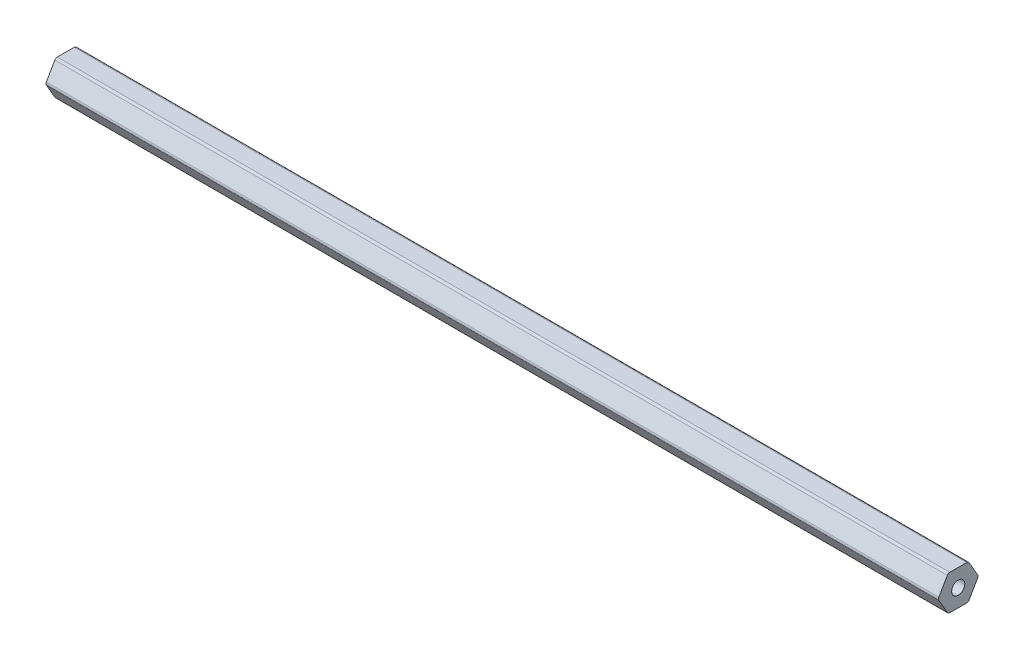
ISO-10303-21;
HEADER;
FILE_DESCRIPTION(('STEP AP214'),'2;1');
FILE_NAME('part.step','',(''),(''),'','','');
FILE_SCHEMA(('AUTOMOTIVE_DESIGN { 1 0 10303 214 1 1 1 1 }'));
ENDSEC;
DATA;
#1=APPLICATION_CONTEXT('core data for automotive mechanical design processes');
#2=APPLICATION_PROTOCOL_DEFINITION('international standard','automotive_design',2000,#1);
#3=PRODUCT_CONTEXT('',#1,'mechanical');
#4=PRODUCT('Part','Part','',(#3));
#5=PRODUCT_RELATED_PRODUCT_CATEGORY('part','',(#4));
#6=PRODUCT_DEFINITION_FORMATION('','',#4);
#7=PRODUCT_DEFINITION_CONTEXT('part definition',#1,'design');
#8=PRODUCT_DEFINITION('design','',#6,#7);
#9=PRODUCT_DEFINITION_SHAPE('','',#8);
#10=(LENGTH_UNIT() NAMED_UNIT(*) SI_UNIT(.MILLI.,.METRE.));
#11=(NAMED_UNIT(*) PLANE_ANGLE_UNIT() SI_UNIT($,.RADIAN.));
#12=(NAMED_UNIT(*) SI_UNIT($,.STERADIAN.) SOLID_ANGLE_UNIT());
#13=UNCERTAINTY_MEASURE_WITH_UNIT(LENGTH_MEASURE(1.E-05),#10,'distance_accuracy_value','');
#14=(GEOMETRIC_REPRESENTATION_CONTEXT(3) GLOBAL_UNCERTAINTY_ASSIGNED_CONTEXT((#13)) GLOBAL_UNIT_ASSIGNED_CONTEXT((#10,
#11,#12)) REPRESENTATION_CONTEXT('',''));
#15=CARTESIAN_POINT('',(0.,0.,0.));
#16=DIRECTION('',(0.,0.,1.));
#17=DIRECTION('',(1.,0.,0.));
#18=AXIS2_PLACEMENT_3D('',#15,#16,#17);
#19=CARTESIAN_POINT('',(323.85,5.334,-3.07958633585748));
#20=DIRECTION('',(-1.,0.,0.));
#21=DIRECTION('',(0.,0.,1.));
#22=AXIS2_PLACEMENT_3D('',#19,#20,#21);
#23=PLANE('',#22);
#24=CARTESIAN_POINT('',(323.85,5.334,-3.07958633585748));
#25=DIRECTION('',(1.,0.,0.));
#26=DIRECTION('',(0.,0.,1.));
#27=AXIS2_PLACEMENT_3D('',#24,#25,#26);
#28=CIRCLE('',#27,1.016);
#29=CARTESIAN_POINT('',(323.85,5.84199999999999,-3.95946814610247));
#30=VERTEX_POINT('',#29);
#31=CARTESIAN_POINT('',(323.85,6.34999999999999,-3.07958633585748));
#32=VERTEX_POINT('',#31);
#33=EDGE_CURVE('E206',#30,#32,#28,.T.);
#34=ORIENTED_EDGE('',*,*,#33,.T.);
#35=DIRECTION('',(0.,0.,1.));
#36=VECTOR('',#35,1.);
#37=CARTESIAN_POINT('',(323.85,6.34999999999999,-3.07958633585748));
#38=LINE('',#37,#36);
#39=CARTESIAN_POINT('',(323.85,6.35000000000001,3.07958633585745));
#40=VERTEX_POINT('',#39);
#41=EDGE_CURVE('E118',#32,#40,#38,.T.);
#42=ORIENTED_EDGE('',*,*,#41,.T.);
#43=CARTESIAN_POINT('',(323.85,5.33400000000001,3.07958633585745));
#44=DIRECTION('',(1.,0.,0.));
#45=DIRECTION('',(0.,0.,1.));
#46=AXIS2_PLACEMENT_3D('',#43,#44,#45);
#47=CIRCLE('',#46,1.016);
#48=CARTESIAN_POINT('',(323.85,5.84200000000001,3.95946814610244));
#49=VERTEX_POINT('',#48);
#50=EDGE_CURVE('E243',#40,#49,#47,.T.);
#51=ORIENTED_EDGE('',*,*,#50,.T.);
#52=DIRECTION('',(0.,-0.866025403784437,0.500000000000003));
#53=VECTOR('',#52,1.);
#54=CARTESIAN_POINT('',(323.85,5.84200000000001,3.95946814610244));
#55=LINE('',#54,#53);
#56=CARTESIAN_POINT('',(323.85,0.508000000000022,7.03905448195992));
#57=VERTEX_POINT('',#56);
#58=EDGE_CURVE('E263',#49,#57,#55,.T.);
#59=ORIENTED_EDGE('',*,*,#58,.T.);
#60=CARTESIAN_POINT('',(323.85,0.,6.15917267171493));
#61=DIRECTION('',(1.,0.,0.));
#62=DIRECTION('',(0.,0.,1.));
#63=AXIS2_PLACEMENT_3D('',#60,#61,#62);
#64=CIRCLE('',#63,1.016);
#65=CARTESIAN_POINT('',(323.85,-0.50799999999998,7.03905448195993));
#66=VERTEX_POINT('',#65);
#67=EDGE_CURVE('E259',#57,#66,#64,.T.);
#68=ORIENTED_EDGE('',*,*,#67,.T.);
#69=DIRECTION('',(0.,-0.86602540378444,-0.499999999999998));
#70=VECTOR('',#69,1.);
#71=CARTESIAN_POINT('',(323.85,-0.507999999999979,7.03905448195992));
#72=LINE('',#71,#70);
#73=CARTESIAN_POINT('',(323.85,-5.84199999999999,3.95946814610247));
#74=VERTEX_POINT('',#73);
#75=EDGE_CURVE('E262',#66,#74,#72,.T.);
#76=ORIENTED_EDGE('',*,*,#75,.T.);
#77=CARTESIAN_POINT('',(323.85,-5.334,3.07958633585748));
#78=DIRECTION('',(1.,0.,0.));
#79=DIRECTION('',(0.,0.,1.));
#80=AXIS2_PLACEMENT_3D('',#77,#78,#79);
#81=CIRCLE('',#80,1.016);
#82=CARTESIAN_POINT('',(323.85,-6.35,3.07958633585748));
#83=VERTEX_POINT('',#82);
#84=EDGE_CURVE('E267',#74,#83,#81,.T.);
#85=ORIENTED_EDGE('',*,*,#84,.T.);
#86=DIRECTION('',(0.,0.,-1.));
#87=VECTOR('',#86,1.);
#88=CARTESIAN_POINT('',(323.85,-6.35,3.07958633585748));
#89=LINE('',#88,#87);
#90=CARTESIAN_POINT('',(323.85,-6.35000000000001,-3.07958633585745));
#91=VERTEX_POINT('',#90);
#92=EDGE_CURVE('E274',#83,#91,#89,.T.);
#93=ORIENTED_EDGE('',*,*,#92,.T.);
#94=CARTESIAN_POINT('',(323.85,-5.33400000000001,-3.07958633585745));
#95=DIRECTION('',(1.,0.,0.));
#96=DIRECTION('',(0.,0.,1.));
#97=AXIS2_PLACEMENT_3D('',#94,#95,#96);
#98=CIRCLE('',#97,1.016);
#99=CARTESIAN_POINT('',(323.85,-5.84200000000001,-3.95946814610244));
#100=VERTEX_POINT('',#99);
#101=EDGE_CURVE('E149',#91,#100,#98,.T.);
#102=ORIENTED_EDGE('',*,*,#101,.T.);
#103=DIRECTION('',(0.,0.866025403784437,-0.500000000000002));
#104=VECTOR('',#103,1.);
#105=CARTESIAN_POINT('',(323.85,-5.84200000000001,-3.95946814610244));
#106=LINE('',#105,#104);
#107=CARTESIAN_POINT('',(323.85,-0.508000000000019,-7.03905448195992));
#108=VERTEX_POINT('',#107);
#109=EDGE_CURVE('E143',#100,#108,#106,.T.);
#110=ORIENTED_EDGE('',*,*,#109,.T.);
#111=CARTESIAN_POINT('',(323.85,0.,-6.15917267171493));
#112=DIRECTION('',(1.,0.,0.));
#113=DIRECTION('',(0.,0.,1.));
#114=AXIS2_PLACEMENT_3D('',#111,#112,#113);
#115=CIRCLE('',#114,1.016);
#116=CARTESIAN_POINT('',(323.85,0.507999999999981,-7.03905448195992));
#117=VERTEX_POINT('',#116);
#118=EDGE_CURVE('E147',#108,#117,#115,.T.);
#119=ORIENTED_EDGE('',*,*,#118,.T.);
#120=DIRECTION('',(0.,0.86602540378444,0.499999999999997));
#121=VECTOR('',#120,1.);
#122=CARTESIAN_POINT('',(323.85,0.50799999999998,-7.03905448195992));
#123=LINE('',#122,#121);
#124=EDGE_CURVE('E63',#117,#30,#123,.T.);
#125=ORIENTED_EDGE('',*,*,#124,.T.);
#126=EDGE_LOOP('',(#34,#42,#51,#59,#68,#76,#85,#93,#102,#110,#119,#125));
#127=FACE_BOUND('',#126,.T.);
#128=CARTESIAN_POINT('',(323.85,0.,0.));
#129=DIRECTION('',(1.,0.,0.));
#130=DIRECTION('',(0.,0.,-1.));
#131=AXIS2_PLACEMENT_3D('',#128,#129,#130);
#132=CIRCLE('',#131,2.38125);
#133=CARTESIAN_POINT('',(323.85,0.,-2.38125));
#134=VERTEX_POINT('',#133);
#135=EDGE_CURVE('E176',#134,#134,#132,.T.);
#136=ORIENTED_EDGE('',*,*,#135,.F.);
#137=EDGE_LOOP('',(#136));
#138=FACE_BOUND('',#137,.T.);
#139=ADVANCED_FACE('F45',(#127,#138),#23,.F.);
#140=CARTESIAN_POINT('',(0.,5.334,-3.07958633585748));
#141=DIRECTION('',(-1.,0.,0.));
#142=DIRECTION('',(0.,0.,1.));
#143=AXIS2_PLACEMENT_3D('',#140,#141,#142);
#144=PLANE('',#143);
#145=CARTESIAN_POINT('',(0.,5.334,-3.07958633585748));
#146=DIRECTION('',(1.,0.,0.));
#147=DIRECTION('',(0.,0.,1.));
#148=AXIS2_PLACEMENT_3D('',#145,#146,#147);
#149=CIRCLE('',#148,1.016);
#150=CARTESIAN_POINT('',(0.,5.84199999999999,-3.95946814610247));
#151=VERTEX_POINT('',#150);
#152=CARTESIAN_POINT('',(0.,6.34999999999999,-3.07958633585748));
#153=VERTEX_POINT('',#152);
#154=EDGE_CURVE('E171',#151,#153,#149,.T.);
#155=ORIENTED_EDGE('',*,*,#154,.F.);
#156=DIRECTION('',(0.,0.86602540378444,0.499999999999997));
#157=VECTOR('',#156,1.);
#158=CARTESIAN_POINT('',(0.,0.50799999999998,-7.03905448195992));
#159=LINE('',#158,#157);
#160=CARTESIAN_POINT('',(0.,0.507999999999981,-7.03905448195992));
#161=VERTEX_POINT('',#160);
#162=EDGE_CURVE('E110',#161,#151,#159,.T.);
#163=ORIENTED_EDGE('',*,*,#162,.F.);
#164=CARTESIAN_POINT('',(0.,0.,-6.15917267171493));
#165=DIRECTION('',(1.,0.,0.));
#166=DIRECTION('',(0.,0.,1.));
#167=AXIS2_PLACEMENT_3D('',#164,#165,#166);
#168=CIRCLE('',#167,1.016);
#169=CARTESIAN_POINT('',(0.,-0.508000000000019,-7.03905448195992));
#170=VERTEX_POINT('',#169);
#171=EDGE_CURVE('E104',#170,#161,#168,.T.);
#172=ORIENTED_EDGE('',*,*,#171,.F.);
#173=DIRECTION('',(0.,0.866025403784437,-0.500000000000002));
#174=VECTOR('',#173,1.);
#175=CARTESIAN_POINT('',(0.,-5.84200000000001,-3.95946814610244));
#176=LINE('',#175,#174);
#177=CARTESIAN_POINT('',(0.,-5.84200000000001,-3.95946814610244));
#178=VERTEX_POINT('',#177);
#179=EDGE_CURVE('E158',#178,#170,#176,.T.);
#180=ORIENTED_EDGE('',*,*,#179,.F.);
#181=CARTESIAN_POINT('',(0.,-5.33400000000001,-3.07958633585745));
#182=DIRECTION('',(1.,0.,0.));
#183=DIRECTION('',(0.,0.,1.));
#184=AXIS2_PLACEMENT_3D('',#181,#182,#183);
#185=CIRCLE('',#184,1.016);
#186=CARTESIAN_POINT('',(0.,-6.35000000000001,-3.07958633585745));
#187=VERTEX_POINT('',#186);
#188=EDGE_CURVE('E197',#187,#178,#185,.T.);
#189=ORIENTED_EDGE('',*,*,#188,.F.);
#190=DIRECTION('',(0.,0.,-1.));
#191=VECTOR('',#190,1.);
#192=CARTESIAN_POINT('',(0.,-6.35,3.07958633585748));
#193=LINE('',#192,#191);
#194=CARTESIAN_POINT('',(0.,-6.35,3.07958633585748));
#195=VERTEX_POINT('',#194);
#196=EDGE_CURVE('E194',#195,#187,#193,.T.);
#197=ORIENTED_EDGE('',*,*,#196,.F.);
#198=CARTESIAN_POINT('',(0.,-5.334,3.07958633585748));
#199=DIRECTION('',(1.,0.,0.));
#200=DIRECTION('',(0.,0.,1.));
#201=AXIS2_PLACEMENT_3D('',#198,#199,#200);
#202=CIRCLE('',#201,1.016);
#203=CARTESIAN_POINT('',(0.,-5.84199999999999,3.95946814610247));
#204=VERTEX_POINT('',#203);
#205=EDGE_CURVE('E191',#204,#195,#202,.T.);
#206=ORIENTED_EDGE('',*,*,#205,.F.);
#207=DIRECTION('',(0.,-0.86602540378444,-0.499999999999998));
#208=VECTOR('',#207,1.);
#209=CARTESIAN_POINT('',(0.,-0.507999999999979,7.03905448195992));
#210=LINE('',#209,#208);
#211=CARTESIAN_POINT('',(0.,-0.50799999999998,7.03905448195993));
#212=VERTEX_POINT('',#211);
#213=EDGE_CURVE('E188',#212,#204,#210,.T.);
#214=ORIENTED_EDGE('',*,*,#213,.F.);
#215=CARTESIAN_POINT('',(0.,0.,6.15917267171493));
#216=DIRECTION('',(1.,0.,0.));
#217=DIRECTION('',(0.,0.,1.));
#218=AXIS2_PLACEMENT_3D('',#215,#216,#217);
#219=CIRCLE('',#218,1.016);
#220=CARTESIAN_POINT('',(0.,0.508000000000022,7.03905448195992));
#221=VERTEX_POINT('',#220);
#222=EDGE_CURVE('E185',#221,#212,#219,.T.);
#223=ORIENTED_EDGE('',*,*,#222,.F.);
#224=DIRECTION('',(0.,-0.866025403784437,0.500000000000003));
#225=VECTOR('',#224,1.);
#226=CARTESIAN_POINT('',(0.,5.84200000000001,3.95946814610244));
#227=LINE('',#226,#225);
#228=CARTESIAN_POINT('',(0.,5.84200000000001,3.95946814610244));
#229=VERTEX_POINT('',#228);
#230=EDGE_CURVE('E182',#229,#221,#227,.T.);
#231=ORIENTED_EDGE('',*,*,#230,.F.);
#232=CARTESIAN_POINT('',(0.,5.33400000000001,3.07958633585745));
#233=DIRECTION('',(1.,0.,0.));
#234=DIRECTION('',(0.,0.,1.));
#235=AXIS2_PLACEMENT_3D('',#232,#233,#234);
#236=CIRCLE('',#235,1.016);
#237=CARTESIAN_POINT('',(0.,6.35000000000001,3.07958633585745));
#238=VERTEX_POINT('',#237);
#239=EDGE_CURVE('E179',#238,#229,#236,.T.);
#240=ORIENTED_EDGE('',*,*,#239,.F.);
#241=DIRECTION('',(0.,0.,1.));
#242=VECTOR('',#241,1.);
#243=CARTESIAN_POINT('',(0.,6.34999999999999,-3.07958633585748));
#244=LINE('',#243,#242);
#245=EDGE_CURVE('E175',#153,#238,#244,.T.);
#246=ORIENTED_EDGE('',*,*,#245,.F.);
#247=EDGE_LOOP('',(#155,#163,#172,#180,#189,#197,#206,#214,#223,#231,#240,#246));
#248=FACE_BOUND('',#247,.T.);
#249=CARTESIAN_POINT('',(0.,0.,0.));
#250=DIRECTION('',(1.,0.,0.));
#251=DIRECTION('',(0.,0.,-1.));
#252=AXIS2_PLACEMENT_3D('',#249,#250,#251);
#253=CIRCLE('',#252,2.38125);
#254=CARTESIAN_POINT('',(0.,0.,-2.38125));
#255=VERTEX_POINT('',#254);
#256=EDGE_CURVE('E474',#255,#255,#253,.T.);
#257=ORIENTED_EDGE('',*,*,#256,.T.);
#258=EDGE_LOOP('',(#257));
#259=FACE_BOUND('',#258,.T.);
#260=ADVANCED_FACE('F247',(#248,#259),#144,.T.);
#261=CARTESIAN_POINT('',(323.85,5.334,-3.07958633585748));
#262=DIRECTION('',(-1.,0.,0.));
#263=DIRECTION('',(0.,0.,1.));
#264=AXIS2_PLACEMENT_3D('',#261,#262,#263);
#265=CYLINDRICAL_SURFACE('',#264,1.016);
#266=ORIENTED_EDGE('',*,*,#154,.T.);
#267=DIRECTION('',(-1.,0.,0.));
#268=VECTOR('',#267,1.);
#269=CARTESIAN_POINT('',(323.85,6.34999999999999,-3.07958633585748));
#270=LINE('',#269,#268);
#271=EDGE_CURVE('E11',#32,#153,#270,.T.);
#272=ORIENTED_EDGE('',*,*,#271,.F.);
#273=ORIENTED_EDGE('',*,*,#33,.F.);
#274=DIRECTION('',(-1.,0.,0.));
#275=VECTOR('',#274,1.);
#276=CARTESIAN_POINT('',(323.85,5.84199999999999,-3.95946814610247));
#277=LINE('',#276,#275);
#278=EDGE_CURVE('E167',#30,#151,#277,.T.);
#279=ORIENTED_EDGE('',*,*,#278,.T.);
#280=EDGE_LOOP('',(#266,#272,#273,#279));
#281=FACE_BOUND('',#280,.T.);
#282=ADVANCED_FACE('F47',(#281),#265,.T.);
#283=CARTESIAN_POINT('',(323.85,6.34999999999999,-3.07958633585748));
#284=DIRECTION('',(0.,-1.,0.));
#285=DIRECTION('',(0.,0.,-1.));
#286=AXIS2_PLACEMENT_3D('',#283,#284,#285);
#287=PLANE('',#286);
#288=ORIENTED_EDGE('',*,*,#245,.T.);
#289=DIRECTION('',(-1.,0.,0.));
#290=VECTOR('',#289,1.);
#291=CARTESIAN_POINT('',(323.85,6.35000000000001,3.07958633585745));
#292=LINE('',#291,#290);
#293=EDGE_CURVE('E55',#40,#238,#292,.T.);
#294=ORIENTED_EDGE('',*,*,#293,.F.);
#295=ORIENTED_EDGE('',*,*,#41,.F.);
#296=ORIENTED_EDGE('',*,*,#271,.T.);
#297=EDGE_LOOP('',(#288,#294,#295,#296));
#298=FACE_BOUND('',#297,.T.);
#299=ADVANCED_FACE('F310',(#298),#287,.F.);
#300=CARTESIAN_POINT('',(323.85,5.33400000000001,3.07958633585745));
#301=DIRECTION('',(-1.,0.,0.));
#302=DIRECTION('',(0.,0.,1.));
#303=AXIS2_PLACEMENT_3D('',#300,#301,#302);
#304=CYLINDRICAL_SURFACE('',#303,1.016);
#305=ORIENTED_EDGE('',*,*,#239,.T.);
#306=DIRECTION('',(-1.,0.,0.));
#307=VECTOR('',#306,1.);
#308=CARTESIAN_POINT('',(323.85,5.84200000000001,3.95946814610244));
#309=LINE('',#308,#307);
#310=EDGE_CURVE('E233',#49,#229,#309,.T.);
#311=ORIENTED_EDGE('',*,*,#310,.F.);
#312=ORIENTED_EDGE('',*,*,#50,.F.);
#313=ORIENTED_EDGE('',*,*,#293,.T.);
#314=EDGE_LOOP('',(#305,#311,#312,#313));
#315=FACE_BOUND('',#314,.T.);
#316=ADVANCED_FACE('F241',(#315),#304,.T.);
#317=CARTESIAN_POINT('',(323.85,5.84200000000001,3.95946814610244));
#318=DIRECTION('',(0.,-0.500000000000003,-0.866025403784437));
#319=DIRECTION('',(0.,0.866025403784437,-0.500000000000003));
#320=AXIS2_PLACEMENT_3D('',#317,#318,#319);
#321=PLANE('',#320);
#322=ORIENTED_EDGE('',*,*,#230,.T.);
#323=DIRECTION('',(-1.,0.,0.));
#324=VECTOR('',#323,1.);
#325=CARTESIAN_POINT('',(323.85,0.508000000000022,7.03905448195992));
#326=LINE('',#325,#324);
#327=EDGE_CURVE('E229',#57,#221,#326,.T.);
#328=ORIENTED_EDGE('',*,*,#327,.F.);
#329=ORIENTED_EDGE('',*,*,#58,.F.);
#330=ORIENTED_EDGE('',*,*,#310,.T.);
#331=EDGE_LOOP('',(#322,#328,#329,#330));
#332=FACE_BOUND('',#331,.T.);
#333=ADVANCED_FACE('F253',(#332),#321,.F.);
#334=CARTESIAN_POINT('',(323.85,0.,6.15917267171493));
#335=DIRECTION('',(-1.,0.,0.));
#336=DIRECTION('',(0.,0.,1.));
#337=AXIS2_PLACEMENT_3D('',#334,#335,#336);
#338=CYLINDRICAL_SURFACE('',#337,1.016);
#339=ORIENTED_EDGE('',*,*,#222,.T.);
#340=DIRECTION('',(-1.,0.,0.));
#341=VECTOR('',#340,1.);
#342=CARTESIAN_POINT('',(323.85,-0.50799999999998,7.03905448195993));
#343=LINE('',#342,#341);
#344=EDGE_CURVE('E225',#66,#212,#343,.T.);
#345=ORIENTED_EDGE('',*,*,#344,.F.);
#346=ORIENTED_EDGE('',*,*,#67,.F.);
#347=ORIENTED_EDGE('',*,*,#327,.T.);
#348=EDGE_LOOP('',(#339,#345,#346,#347));
#349=FACE_BOUND('',#348,.T.);
#350=ADVANCED_FACE('F257',(#349),#338,.T.);
#351=CARTESIAN_POINT('',(323.85,-0.507999999999979,7.03905448195992));
#352=DIRECTION('',(0.,0.499999999999998,-0.86602540378444));
#353=DIRECTION('',(0.,0.86602540378444,0.499999999999998));
#354=AXIS2_PLACEMENT_3D('',#351,#352,#353);
#355=PLANE('',#354);
#356=ORIENTED_EDGE('',*,*,#213,.T.);
#357=DIRECTION('',(-1.,0.,0.));
#358=VECTOR('',#357,1.);
#359=CARTESIAN_POINT('',(323.85,-5.84199999999999,3.95946814610247));
#360=LINE('',#359,#358);
#361=EDGE_CURVE('E221',#74,#204,#360,.T.);
#362=ORIENTED_EDGE('',*,*,#361,.F.);
#363=ORIENTED_EDGE('',*,*,#75,.F.);
#364=ORIENTED_EDGE('',*,*,#344,.T.);
#365=EDGE_LOOP('',(#356,#362,#363,#364));
#366=FACE_BOUND('',#365,.T.);
#367=ADVANCED_FACE('F323',(#366),#355,.F.);
#368=CARTESIAN_POINT('',(323.85,-5.334,3.07958633585748));
#369=DIRECTION('',(-1.,0.,0.));
#370=DIRECTION('',(0.,0.,1.));
#371=AXIS2_PLACEMENT_3D('',#368,#369,#370);
#372=CYLINDRICAL_SURFACE('',#371,1.016);
#373=ORIENTED_EDGE('',*,*,#205,.T.);
#374=DIRECTION('',(-1.,0.,0.));
#375=VECTOR('',#374,1.);
#376=CARTESIAN_POINT('',(323.85,-6.35,3.07958633585748));
#377=LINE('',#376,#375);
#378=EDGE_CURVE('E217',#83,#195,#377,.T.);
#379=ORIENTED_EDGE('',*,*,#378,.F.);
#380=ORIENTED_EDGE('',*,*,#84,.F.);
#381=ORIENTED_EDGE('',*,*,#361,.T.);
#382=EDGE_LOOP('',(#373,#379,#380,#381));
#383=FACE_BOUND('',#382,.T.);
#384=ADVANCED_FACE('F326',(#383),#372,.T.);
#385=CARTESIAN_POINT('',(323.85,-6.35,3.07958633585748));
#386=DIRECTION('',(0.,1.,0.));
#387=DIRECTION('',(0.,0.,1.));
#388=AXIS2_PLACEMENT_3D('',#385,#386,#387);
#389=PLANE('',#388);
#390=ORIENTED_EDGE('',*,*,#196,.T.);
#391=DIRECTION('',(-1.,0.,0.));
#392=VECTOR('',#391,1.);
#393=CARTESIAN_POINT('',(323.85,-6.35000000000001,-3.07958633585745));
#394=LINE('',#393,#392);
#395=EDGE_CURVE('E213',#91,#187,#394,.T.);
#396=ORIENTED_EDGE('',*,*,#395,.F.);
#397=ORIENTED_EDGE('',*,*,#92,.F.);
#398=ORIENTED_EDGE('',*,*,#378,.T.);
#399=EDGE_LOOP('',(#390,#396,#397,#398));
#400=FACE_BOUND('',#399,.T.);
#401=ADVANCED_FACE('F282',(#400),#389,.F.);
#402=CARTESIAN_POINT('',(323.85,-5.33400000000001,-3.07958633585745));
#403=DIRECTION('',(-1.,0.,0.));
#404=DIRECTION('',(0.,0.,1.));
#405=AXIS2_PLACEMENT_3D('',#402,#403,#404);
#406=CYLINDRICAL_SURFACE('',#405,1.016);
#407=ORIENTED_EDGE('',*,*,#188,.T.);
#408=DIRECTION('',(-1.,0.,0.));
#409=VECTOR('',#408,1.);
#410=CARTESIAN_POINT('',(323.85,-5.84200000000001,-3.95946814610244));
#411=LINE('',#410,#409);
#412=EDGE_CURVE('E160',#100,#178,#411,.T.);
#413=ORIENTED_EDGE('',*,*,#412,.F.);
#414=ORIENTED_EDGE('',*,*,#101,.F.);
#415=ORIENTED_EDGE('',*,*,#395,.T.);
#416=EDGE_LOOP('',(#407,#413,#414,#415));
#417=FACE_BOUND('',#416,.T.);
#418=ADVANCED_FACE('F286',(#417),#406,.T.);
#419=CARTESIAN_POINT('',(323.85,-5.84200000000001,-3.95946814610244));
#420=DIRECTION('',(0.,0.500000000000002,0.866025403784437));
#421=DIRECTION('',(0.,-0.866025403784437,0.500000000000002));
#422=AXIS2_PLACEMENT_3D('',#419,#420,#421);
#423=PLANE('',#422);
#424=ORIENTED_EDGE('',*,*,#179,.T.);
#425=DIRECTION('',(-1.,0.,0.));
#426=VECTOR('',#425,1.);
#427=CARTESIAN_POINT('',(323.85,-0.508000000000019,-7.03905448195992));
#428=LINE('',#427,#426);
#429=EDGE_CURVE('E155',#108,#170,#428,.T.);
#430=ORIENTED_EDGE('',*,*,#429,.F.);
#431=ORIENTED_EDGE('',*,*,#109,.F.);
#432=ORIENTED_EDGE('',*,*,#412,.T.);
#433=EDGE_LOOP('',(#424,#430,#431,#432));
#434=FACE_BOUND('',#433,.T.);
#435=ADVANCED_FACE('F156',(#434),#423,.F.);
#436=CARTESIAN_POINT('',(323.85,0.,-6.15917267171493));
#437=DIRECTION('',(-1.,0.,0.));
#438=DIRECTION('',(0.,0.,1.));
#439=AXIS2_PLACEMENT_3D('',#436,#437,#438);
#440=CYLINDRICAL_SURFACE('',#439,1.016);
#441=ORIENTED_EDGE('',*,*,#171,.T.);
#442=DIRECTION('',(-1.,0.,0.));
#443=VECTOR('',#442,1.);
#444=CARTESIAN_POINT('',(323.85,0.507999999999981,-7.03905448195992));
#445=LINE('',#444,#443);
#446=EDGE_CURVE('E161',#117,#161,#445,.T.);
#447=ORIENTED_EDGE('',*,*,#446,.F.);
#448=ORIENTED_EDGE('',*,*,#118,.F.);
#449=ORIENTED_EDGE('',*,*,#429,.T.);
#450=EDGE_LOOP('',(#441,#447,#448,#449));
#451=FACE_BOUND('',#450,.T.);
#452=ADVANCED_FACE('F163',(#451),#440,.T.);
#453=CARTESIAN_POINT('',(323.85,0.50799999999998,-7.03905448195992));
#454=DIRECTION('',(0.,-0.499999999999997,0.86602540378444));
#455=DIRECTION('',(0.,-0.86602540378444,-0.499999999999997));
#456=AXIS2_PLACEMENT_3D('',#453,#454,#455);
#457=PLANE('',#456);
#458=ORIENTED_EDGE('',*,*,#162,.T.);
#459=ORIENTED_EDGE('',*,*,#278,.F.);
#460=ORIENTED_EDGE('',*,*,#124,.F.);
#461=ORIENTED_EDGE('',*,*,#446,.T.);
#462=EDGE_LOOP('',(#458,#459,#460,#461));
#463=FACE_BOUND('',#462,.T.);
#464=ADVANCED_FACE('F290',(#463),#457,.F.);
#465=CARTESIAN_POINT('',(323.85,0.,0.));
#466=DIRECTION('',(-1.,0.,0.));
#467=DIRECTION('',(0.,0.,1.));
#468=AXIS2_PLACEMENT_3D('',#465,#466,#467);
#469=CYLINDRICAL_SURFACE('',#468,2.38125);
#470=ORIENTED_EDGE('',*,*,#135,.T.);
#471=EDGE_LOOP('',(#470));
#472=FACE_BOUND('',#471,.T.);
#473=ORIENTED_EDGE('',*,*,#256,.F.);
#474=EDGE_LOOP('',(#473));
#475=FACE_BOUND('',#474,.T.);
#476=ADVANCED_FACE('F292',(#472,#475),#469,.F.);
#477=CLOSED_SHELL('',(#139,#260,#282,#299,#316,#333,#350,#367,#384,#401,#418,#435,#452,#464,#476));
#478=MANIFOLD_SOLID_BREP('B2',#477);
#479=ADVANCED_BREP_SHAPE_REPRESENTATION('',(#18,#478),#14);
#480=SHAPE_DEFINITION_REPRESENTATION(#9,#479);
ENDSEC;
END-ISO-10303-21;
